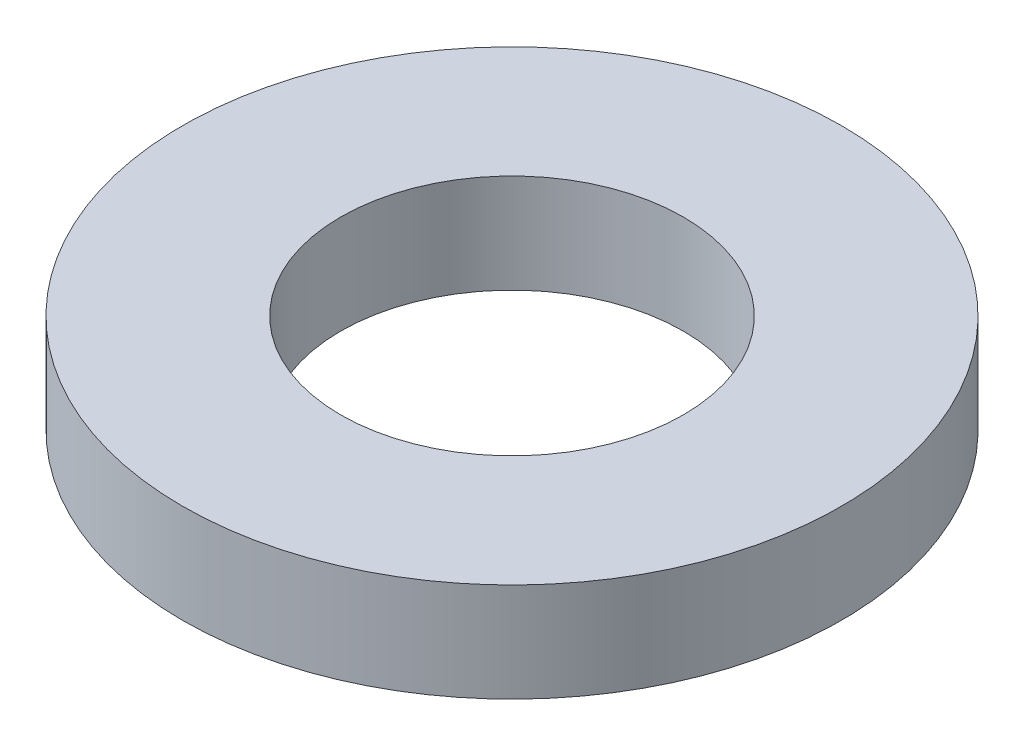
ISO-10303-21;
HEADER;
FILE_DESCRIPTION(('STEP AP214'),'2;1');
FILE_NAME('part.step','',(''),(''),'','','');
FILE_SCHEMA(('AUTOMOTIVE_DESIGN { 1 0 10303 214 1 1 1 1 }'));
ENDSEC;
DATA;
#1=APPLICATION_CONTEXT('core data for automotive mechanical design processes');
#2=APPLICATION_PROTOCOL_DEFINITION('international standard','automotive_design',2000,#1);
#3=PRODUCT_CONTEXT('',#1,'mechanical');
#4=PRODUCT('Part','Part','',(#3));
#5=PRODUCT_RELATED_PRODUCT_CATEGORY('part','',(#4));
#6=PRODUCT_DEFINITION_FORMATION('','',#4);
#7=PRODUCT_DEFINITION_CONTEXT('part definition',#1,'design');
#8=PRODUCT_DEFINITION('design','',#6,#7);
#9=PRODUCT_DEFINITION_SHAPE('','',#8);
#10=(LENGTH_UNIT() NAMED_UNIT(*) SI_UNIT(.MILLI.,.METRE.));
#11=(NAMED_UNIT(*) PLANE_ANGLE_UNIT() SI_UNIT($,.RADIAN.));
#12=(NAMED_UNIT(*) SI_UNIT($,.STERADIAN.) SOLID_ANGLE_UNIT());
#13=UNCERTAINTY_MEASURE_WITH_UNIT(LENGTH_MEASURE(1.E-05),#10,'distance_accuracy_value','');
#14=(GEOMETRIC_REPRESENTATION_CONTEXT(3) GLOBAL_UNCERTAINTY_ASSIGNED_CONTEXT((#13)) GLOBAL_UNIT_ASSIGNED_CONTEXT((#10,
#11,#12)) REPRESENTATION_CONTEXT('',''));
#15=CARTESIAN_POINT('',(0.,0.,0.));
#16=DIRECTION('',(0.,0.,1.));
#17=DIRECTION('',(1.,0.,0.));
#18=AXIS2_PLACEMENT_3D('',#15,#16,#17);
#19=CARTESIAN_POINT('',(0.,1.5,0.));
#20=DIRECTION('',(0.,1.,0.));
#21=DIRECTION('',(0.,0.,1.));
#22=AXIS2_PLACEMENT_3D('',#19,#20,#21);
#23=PLANE('',#22);
#24=CARTESIAN_POINT('',(0.,1.5,0.));
#25=DIRECTION('',(0.,1.,0.));
#26=DIRECTION('',(0.,0.,1.));
#27=AXIS2_PLACEMENT_3D('',#24,#25,#26);
#28=CIRCLE('',#27,5.);
#29=CARTESIAN_POINT('',(0.,1.5,5.));
#30=VERTEX_POINT('',#29);
#31=EDGE_CURVE('E10',#30,#30,#28,.T.);
#32=ORIENTED_EDGE('',*,*,#31,.T.);
#33=EDGE_LOOP('',(#32));
#34=FACE_BOUND('',#33,.T.);
#35=CARTESIAN_POINT('',(0.,1.5,0.));
#36=DIRECTION('',(0.,1.,0.));
#37=DIRECTION('',(0.,0.,1.));
#38=AXIS2_PLACEMENT_3D('',#35,#36,#37);
#39=CIRCLE('',#38,2.6);
#40=CARTESIAN_POINT('',(0.,1.5,2.6));
#41=VERTEX_POINT('',#40);
#42=EDGE_CURVE('E44',#41,#41,#39,.T.);
#43=ORIENTED_EDGE('',*,*,#42,.F.);
#44=EDGE_LOOP('',(#43));
#45=FACE_BOUND('',#44,.T.);
#46=ADVANCED_FACE('F33',(#34,#45),#23,.T.);
#47=CARTESIAN_POINT('',(0.,0.,0.));
#48=DIRECTION('',(0.,1.,0.));
#49=DIRECTION('',(0.,0.,1.));
#50=AXIS2_PLACEMENT_3D('',#47,#48,#49);
#51=PLANE('',#50);
#52=CARTESIAN_POINT('',(0.,0.,0.));
#53=DIRECTION('',(0.,1.,0.));
#54=DIRECTION('',(0.,0.,1.));
#55=AXIS2_PLACEMENT_3D('',#52,#53,#54);
#56=CIRCLE('',#55,5.);
#57=CARTESIAN_POINT('',(0.,0.,5.));
#58=VERTEX_POINT('',#57);
#59=EDGE_CURVE('E37',#58,#58,#56,.T.);
#60=ORIENTED_EDGE('',*,*,#59,.F.);
#61=EDGE_LOOP('',(#60));
#62=FACE_BOUND('',#61,.T.);
#63=CARTESIAN_POINT('',(0.,0.,0.));
#64=DIRECTION('',(0.,1.,0.));
#65=DIRECTION('',(0.,0.,1.));
#66=AXIS2_PLACEMENT_3D('',#63,#64,#65);
#67=CIRCLE('',#66,2.6);
#68=CARTESIAN_POINT('',(0.,0.,2.6));
#69=VERTEX_POINT('',#68);
#70=EDGE_CURVE('E46',#69,#69,#67,.T.);
#71=ORIENTED_EDGE('',*,*,#70,.T.);
#72=EDGE_LOOP('',(#71));
#73=FACE_BOUND('',#72,.T.);
#74=ADVANCED_FACE('F56',(#62,#73),#51,.F.);
#75=CARTESIAN_POINT('',(0.,1.5,0.));
#76=DIRECTION('',(0.,-1.,0.));
#77=DIRECTION('',(0.,0.,-1.));
#78=AXIS2_PLACEMENT_3D('',#75,#76,#77);
#79=CYLINDRICAL_SURFACE('',#78,5.);
#80=ORIENTED_EDGE('',*,*,#31,.F.);
#81=EDGE_LOOP('',(#80));
#82=FACE_BOUND('',#81,.T.);
#83=ORIENTED_EDGE('',*,*,#59,.T.);
#84=EDGE_LOOP('',(#83));
#85=FACE_BOUND('',#84,.T.);
#86=ADVANCED_FACE('F35',(#82,#85),#79,.T.);
#87=CARTESIAN_POINT('',(0.,1.5,0.));
#88=DIRECTION('',(0.,-1.,0.));
#89=DIRECTION('',(0.,0.,-1.));
#90=AXIS2_PLACEMENT_3D('',#87,#88,#89);
#91=CYLINDRICAL_SURFACE('',#90,2.6);
#92=ORIENTED_EDGE('',*,*,#42,.T.);
#93=EDGE_LOOP('',(#92));
#94=FACE_BOUND('',#93,.T.);
#95=ORIENTED_EDGE('',*,*,#70,.F.);
#96=EDGE_LOOP('',(#95));
#97=FACE_BOUND('',#96,.T.);
#98=ADVANCED_FACE('F52',(#94,#97),#91,.F.);
#99=CLOSED_SHELL('',(#46,#74,#86,#98));
#100=MANIFOLD_SOLID_BREP('B2',#99);
#101=ADVANCED_BREP_SHAPE_REPRESENTATION('',(#18,#100),#14);
#102=SHAPE_DEFINITION_REPRESENTATION(#9,#101);
ENDSEC;
END-ISO-10303-21;
